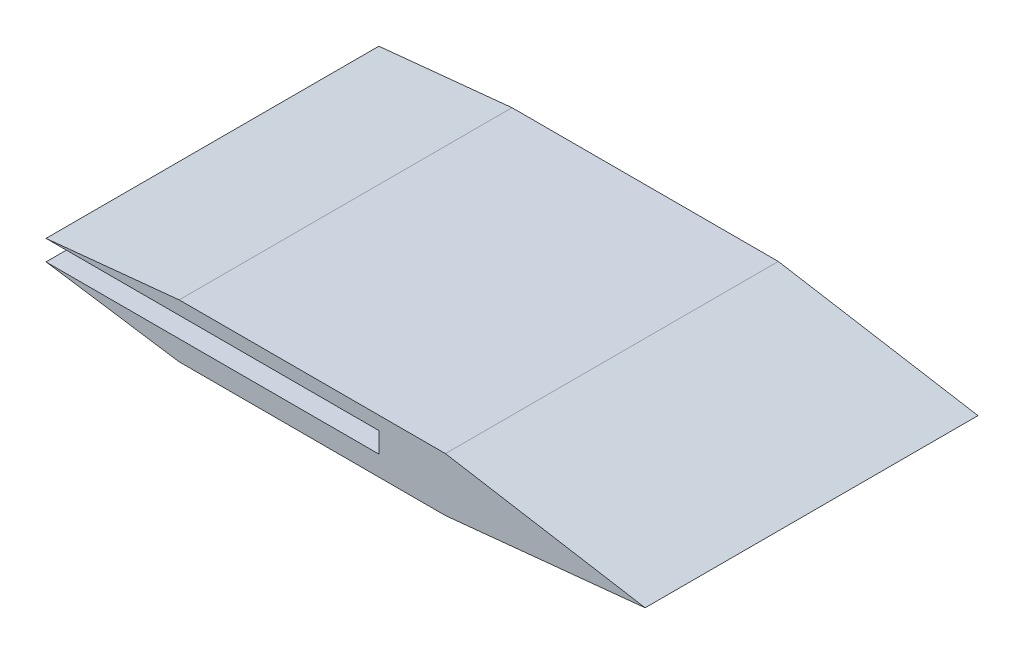
ISO-10303-21;
HEADER;
FILE_DESCRIPTION(('STEP AP214'),'2;1');
FILE_NAME('part.step','',(''),(''),'','','');
FILE_SCHEMA(('AUTOMOTIVE_DESIGN { 1 0 10303 214 1 1 1 1 }'));
ENDSEC;
DATA;
#1=APPLICATION_CONTEXT('core data for automotive mechanical design processes');
#2=APPLICATION_PROTOCOL_DEFINITION('international standard','automotive_design',2000,#1);
#3=PRODUCT_CONTEXT('',#1,'mechanical');
#4=PRODUCT('Part','Part','',(#3));
#5=PRODUCT_RELATED_PRODUCT_CATEGORY('part','',(#4));
#6=PRODUCT_DEFINITION_FORMATION('','',#4);
#7=PRODUCT_DEFINITION_CONTEXT('part definition',#1,'design');
#8=PRODUCT_DEFINITION('design','',#6,#7);
#9=PRODUCT_DEFINITION_SHAPE('','',#8);
#10=(LENGTH_UNIT() NAMED_UNIT(*) SI_UNIT(.MILLI.,.METRE.));
#11=(NAMED_UNIT(*) PLANE_ANGLE_UNIT() SI_UNIT($,.RADIAN.));
#12=(NAMED_UNIT(*) SI_UNIT($,.STERADIAN.) SOLID_ANGLE_UNIT());
#13=UNCERTAINTY_MEASURE_WITH_UNIT(LENGTH_MEASURE(1.E-05),#10,'distance_accuracy_value','');
#14=(GEOMETRIC_REPRESENTATION_CONTEXT(3) GLOBAL_UNCERTAINTY_ASSIGNED_CONTEXT((#13)) GLOBAL_UNIT_ASSIGNED_CONTEXT((#10,
#11,#12)) REPRESENTATION_CONTEXT('',''));
#15=CARTESIAN_POINT('',(0.,0.,0.));
#16=DIRECTION('',(0.,0.,1.));
#17=DIRECTION('',(1.,0.,0.));
#18=AXIS2_PLACEMENT_3D('',#15,#16,#17);
#19=CARTESIAN_POINT('',(50.,0.,50.));
#20=DIRECTION('',(0.,1.,0.));
#21=DIRECTION('',(-1.,0.,0.));
#22=AXIS2_PLACEMENT_3D('',#19,#20,#21);
#23=PLANE('',#22);
#24=DIRECTION('',(1.,0.,0.));
#25=VECTOR('',#24,1.);
#26=CARTESIAN_POINT('',(50.,0.,0.));
#27=LINE('',#26,#25);
#28=CARTESIAN_POINT('',(0.,0.,0.));
#29=VERTEX_POINT('',#28);
#30=CARTESIAN_POINT('',(50.,0.,0.));
#31=VERTEX_POINT('',#30);
#32=EDGE_CURVE('E134',#29,#31,#27,.T.);
#33=ORIENTED_EDGE('',*,*,#32,.T.);
#34=DIRECTION('',(0.,0.,-1.));
#35=VECTOR('',#34,1.);
#36=CARTESIAN_POINT('',(50.,0.,50.));
#37=LINE('',#36,#35);
#38=CARTESIAN_POINT('',(50.,0.,50.));
#39=VERTEX_POINT('',#38);
#40=EDGE_CURVE('E11',#39,#31,#37,.T.);
#41=ORIENTED_EDGE('',*,*,#40,.F.);
#42=DIRECTION('',(1.,0.,0.));
#43=VECTOR('',#42,1.);
#44=CARTESIAN_POINT('',(50.,0.,50.));
#45=LINE('',#44,#43);
#46=CARTESIAN_POINT('',(0.,0.,50.));
#47=VERTEX_POINT('',#46);
#48=EDGE_CURVE('E150',#47,#39,#45,.T.);
#49=ORIENTED_EDGE('',*,*,#48,.F.);
#50=DIRECTION('',(0.,0.,-1.));
#51=VECTOR('',#50,1.);
#52=CARTESIAN_POINT('',(0.,0.,50.));
#53=LINE('',#52,#51);
#54=EDGE_CURVE('E130',#47,#29,#53,.T.);
#55=ORIENTED_EDGE('',*,*,#54,.T.);
#56=EDGE_LOOP('',(#33,#41,#49,#55));
#57=FACE_BOUND('',#56,.T.);
#58=ADVANCED_FACE('F32',(#57),#23,.F.);
#59=CARTESIAN_POINT('',(50.,-3.06,50.));
#60=DIRECTION('',(1.,0.,0.));
#61=DIRECTION('',(0.,0.,-1.));
#62=AXIS2_PLACEMENT_3D('',#59,#60,#61);
#63=PLANE('',#62);
#64=DIRECTION('',(0.,-1.,0.));
#65=VECTOR('',#64,1.);
#66=CARTESIAN_POINT('',(50.,-3.06,0.));
#67=LINE('',#66,#65);
#68=CARTESIAN_POINT('',(50.,-3.06,0.));
#69=VERTEX_POINT('',#68);
#70=EDGE_CURVE('E137',#31,#69,#67,.T.);
#71=ORIENTED_EDGE('',*,*,#70,.T.);
#72=DIRECTION('',(0.,0.,-1.));
#73=VECTOR('',#72,1.);
#74=CARTESIAN_POINT('',(50.,-3.06,50.));
#75=LINE('',#74,#73);
#76=CARTESIAN_POINT('',(50.,-3.06,50.));
#77=VERTEX_POINT('',#76);
#78=EDGE_CURVE('E40',#77,#69,#75,.T.);
#79=ORIENTED_EDGE('',*,*,#78,.F.);
#80=DIRECTION('',(0.,-1.,0.));
#81=VECTOR('',#80,1.);
#82=CARTESIAN_POINT('',(50.,-3.06,50.));
#83=LINE('',#82,#81);
#84=EDGE_CURVE('E94',#39,#77,#83,.T.);
#85=ORIENTED_EDGE('',*,*,#84,.F.);
#86=ORIENTED_EDGE('',*,*,#40,.T.);
#87=EDGE_LOOP('',(#71,#79,#85,#86));
#88=FACE_BOUND('',#87,.T.);
#89=ADVANCED_FACE('F193',(#88),#63,.F.);
#90=CARTESIAN_POINT('',(0.,-3.06,50.));
#91=DIRECTION('',(0.,-1.,0.));
#92=DIRECTION('',(0.,0.,-1.));
#93=AXIS2_PLACEMENT_3D('',#90,#91,#92);
#94=PLANE('',#93);
#95=DIRECTION('',(-1.,0.,0.));
#96=VECTOR('',#95,1.);
#97=CARTESIAN_POINT('',(0.,-3.06,0.));
#98=LINE('',#97,#96);
#99=CARTESIAN_POINT('',(0.,-3.06,0.));
#100=VERTEX_POINT('',#99);
#101=EDGE_CURVE('E139',#69,#100,#98,.T.);
#102=ORIENTED_EDGE('',*,*,#101,.T.);
#103=DIRECTION('',(0.,0.,-1.));
#104=VECTOR('',#103,1.);
#105=CARTESIAN_POINT('',(0.,-3.06,50.));
#106=LINE('',#105,#104);
#107=CARTESIAN_POINT('',(0.,-3.06,50.));
#108=VERTEX_POINT('',#107);
#109=EDGE_CURVE('E160',#108,#100,#106,.T.);
#110=ORIENTED_EDGE('',*,*,#109,.F.);
#111=DIRECTION('',(-1.,0.,0.));
#112=VECTOR('',#111,1.);
#113=CARTESIAN_POINT('',(0.,-3.06,50.));
#114=LINE('',#113,#112);
#115=EDGE_CURVE('E168',#77,#108,#114,.T.);
#116=ORIENTED_EDGE('',*,*,#115,.F.);
#117=ORIENTED_EDGE('',*,*,#78,.T.);
#118=EDGE_LOOP('',(#102,#110,#116,#117));
#119=FACE_BOUND('',#118,.T.);
#120=ADVANCED_FACE('F166',(#119),#94,.F.);
#121=CARTESIAN_POINT('',(20.,-6.06,50.));
#122=DIRECTION('',(0.148340452930245,0.988936352868298,0.));
#123=DIRECTION('',(-0.988936352868298,0.148340452930245,0.));
#124=AXIS2_PLACEMENT_3D('',#121,#122,#123);
#125=PLANE('',#124);
#126=DIRECTION('',(0.988936352868298,-0.148340452930245,0.));
#127=VECTOR('',#126,1.);
#128=CARTESIAN_POINT('',(20.,-6.06,0.));
#129=LINE('',#128,#127);
#130=CARTESIAN_POINT('',(20.,-6.06,0.));
#131=VERTEX_POINT('',#130);
#132=EDGE_CURVE('E141',#100,#131,#129,.T.);
#133=ORIENTED_EDGE('',*,*,#132,.T.);
#134=DIRECTION('',(0.,0.,-1.));
#135=VECTOR('',#134,1.);
#136=CARTESIAN_POINT('',(20.,-6.06,50.));
#137=LINE('',#136,#135);
#138=CARTESIAN_POINT('',(20.,-6.06,50.));
#139=VERTEX_POINT('',#138);
#140=EDGE_CURVE('E157',#139,#131,#137,.T.);
#141=ORIENTED_EDGE('',*,*,#140,.F.);
#142=DIRECTION('',(0.988936352868298,-0.148340452930245,0.));
#143=VECTOR('',#142,1.);
#144=CARTESIAN_POINT('',(20.,-6.06,50.));
#145=LINE('',#144,#143);
#146=EDGE_CURVE('E184',#108,#139,#145,.T.);
#147=ORIENTED_EDGE('',*,*,#146,.F.);
#148=ORIENTED_EDGE('',*,*,#109,.T.);
#149=EDGE_LOOP('',(#133,#141,#147,#148));
#150=FACE_BOUND('',#149,.T.);
#151=ADVANCED_FACE('F177',(#150),#125,.F.);
#152=CARTESIAN_POINT('',(60.,-6.06,50.));
#153=DIRECTION('',(0.,1.,0.));
#154=DIRECTION('',(-1.,0.,0.));
#155=AXIS2_PLACEMENT_3D('',#152,#153,#154);
#156=PLANE('',#155);
#157=DIRECTION('',(1.,0.,0.));
#158=VECTOR('',#157,1.);
#159=CARTESIAN_POINT('',(60.,-6.06,0.));
#160=LINE('',#159,#158);
#161=CARTESIAN_POINT('',(60.,-6.06,0.));
#162=VERTEX_POINT('',#161);
#163=EDGE_CURVE('E143',#131,#162,#160,.T.);
#164=ORIENTED_EDGE('',*,*,#163,.T.);
#165=DIRECTION('',(0.,0.,-1.));
#166=VECTOR('',#165,1.);
#167=CARTESIAN_POINT('',(60.,-6.06,50.));
#168=LINE('',#167,#166);
#169=CARTESIAN_POINT('',(60.,-6.06,50.));
#170=VERTEX_POINT('',#169);
#171=EDGE_CURVE('E154',#170,#162,#168,.T.);
#172=ORIENTED_EDGE('',*,*,#171,.F.);
#173=DIRECTION('',(1.,0.,0.));
#174=VECTOR('',#173,1.);
#175=CARTESIAN_POINT('',(60.,-6.06,50.));
#176=LINE('',#175,#174);
#177=EDGE_CURVE('E183',#139,#170,#176,.T.);
#178=ORIENTED_EDGE('',*,*,#177,.F.);
#179=ORIENTED_EDGE('',*,*,#140,.T.);
#180=EDGE_LOOP('',(#164,#172,#178,#179));
#181=FACE_BOUND('',#180,.T.);
#182=ADVANCED_FACE('F181',(#181),#156,.F.);
#183=CARTESIAN_POINT('',(90.,-3.06,50.));
#184=DIRECTION('',(-0.0995037190209989,0.995037190209989,0.));
#185=DIRECTION('',(-0.995037190209989,-0.0995037190209989,0.));
#186=AXIS2_PLACEMENT_3D('',#183,#184,#185);
#187=PLANE('',#186);
#188=DIRECTION('',(0.995037190209989,0.0995037190209989,0.));
#189=VECTOR('',#188,1.);
#190=CARTESIAN_POINT('',(90.,-3.06,0.));
#191=LINE('',#190,#189);
#192=CARTESIAN_POINT('',(90.,-3.06,0.));
#193=VERTEX_POINT('',#192);
#194=EDGE_CURVE('E145',#162,#193,#191,.T.);
#195=ORIENTED_EDGE('',*,*,#194,.T.);
#196=DIRECTION('',(0.,0.,-1.));
#197=VECTOR('',#196,1.);
#198=CARTESIAN_POINT('',(90.,-3.06,50.));
#199=LINE('',#198,#197);
#200=CARTESIAN_POINT('',(90.,-3.06,50.));
#201=VERTEX_POINT('',#200);
#202=EDGE_CURVE('E125',#201,#193,#199,.T.);
#203=ORIENTED_EDGE('',*,*,#202,.F.);
#204=DIRECTION('',(0.995037190209989,0.0995037190209989,0.));
#205=VECTOR('',#204,1.);
#206=CARTESIAN_POINT('',(90.,-3.06,50.));
#207=LINE('',#206,#205);
#208=EDGE_CURVE('E116',#170,#201,#207,.T.);
#209=ORIENTED_EDGE('',*,*,#208,.F.);
#210=ORIENTED_EDGE('',*,*,#171,.T.);
#211=EDGE_LOOP('',(#195,#203,#209,#210));
#212=FACE_BOUND('',#211,.T.);
#213=ADVANCED_FACE('F205',(#212),#187,.F.);
#214=CARTESIAN_POINT('',(60.,2.,50.));
#215=DIRECTION('',(-0.166317519540524,-0.986072250240259,0.));
#216=DIRECTION('',(0.986072250240259,-0.166317519540524,0.));
#217=AXIS2_PLACEMENT_3D('',#214,#215,#216);
#218=PLANE('',#217);
#219=DIRECTION('',(-0.986072250240259,0.166317519540524,0.));
#220=VECTOR('',#219,1.);
#221=CARTESIAN_POINT('',(60.,2.,0.));
#222=LINE('',#221,#220);
#223=CARTESIAN_POINT('',(60.,2.,0.));
#224=VERTEX_POINT('',#223);
#225=EDGE_CURVE('E124',#193,#224,#222,.T.);
#226=ORIENTED_EDGE('',*,*,#225,.T.);
#227=DIRECTION('',(0.,0.,-1.));
#228=VECTOR('',#227,1.);
#229=CARTESIAN_POINT('',(60.,2.,50.));
#230=LINE('',#229,#228);
#231=CARTESIAN_POINT('',(60.,2.,50.));
#232=VERTEX_POINT('',#231);
#233=EDGE_CURVE('E121',#232,#224,#230,.T.);
#234=ORIENTED_EDGE('',*,*,#233,.F.);
#235=DIRECTION('',(-0.986072250240259,0.166317519540524,0.));
#236=VECTOR('',#235,1.);
#237=CARTESIAN_POINT('',(60.,2.,50.));
#238=LINE('',#237,#236);
#239=EDGE_CURVE('E110',#201,#232,#238,.T.);
#240=ORIENTED_EDGE('',*,*,#239,.F.);
#241=ORIENTED_EDGE('',*,*,#202,.T.);
#242=EDGE_LOOP('',(#226,#234,#240,#241));
#243=FACE_BOUND('',#242,.T.);
#244=ADVANCED_FACE('F122',(#243),#218,.F.);
#245=CARTESIAN_POINT('',(20.,2.,50.));
#246=DIRECTION('',(0.,-1.,0.));
#247=DIRECTION('',(0.,0.,-1.));
#248=AXIS2_PLACEMENT_3D('',#245,#246,#247);
#249=PLANE('',#248);
#250=DIRECTION('',(-1.,0.,0.));
#251=VECTOR('',#250,1.);
#252=CARTESIAN_POINT('',(20.,2.,0.));
#253=LINE('',#252,#251);
#254=CARTESIAN_POINT('',(20.,2.,0.));
#255=VERTEX_POINT('',#254);
#256=EDGE_CURVE('E80',#224,#255,#253,.T.);
#257=ORIENTED_EDGE('',*,*,#256,.T.);
#258=DIRECTION('',(0.,0.,-1.));
#259=VECTOR('',#258,1.);
#260=CARTESIAN_POINT('',(20.,2.,50.));
#261=LINE('',#260,#259);
#262=CARTESIAN_POINT('',(20.,2.,50.));
#263=VERTEX_POINT('',#262);
#264=EDGE_CURVE('E126',#263,#255,#261,.T.);
#265=ORIENTED_EDGE('',*,*,#264,.F.);
#266=DIRECTION('',(-1.,0.,0.));
#267=VECTOR('',#266,1.);
#268=CARTESIAN_POINT('',(20.,2.,50.));
#269=LINE('',#268,#267);
#270=EDGE_CURVE('E114',#232,#263,#269,.T.);
#271=ORIENTED_EDGE('',*,*,#270,.F.);
#272=ORIENTED_EDGE('',*,*,#233,.T.);
#273=EDGE_LOOP('',(#257,#265,#271,#272));
#274=FACE_BOUND('',#273,.T.);
#275=ADVANCED_FACE('F128',(#274),#249,.F.);
#276=CARTESIAN_POINT('',(0.,0.,50.));
#277=DIRECTION('',(0.0995037190209987,-0.995037190209989,0.));
#278=DIRECTION('',(0.995037190209989,0.0995037190209987,0.));
#279=AXIS2_PLACEMENT_3D('',#276,#277,#278);
#280=PLANE('',#279);
#281=DIRECTION('',(-0.995037190209989,-0.0995037190209987,0.));
#282=VECTOR('',#281,1.);
#283=CARTESIAN_POINT('',(0.,0.,0.));
#284=LINE('',#283,#282);
#285=EDGE_CURVE('E86',#255,#29,#284,.T.);
#286=ORIENTED_EDGE('',*,*,#285,.T.);
#287=ORIENTED_EDGE('',*,*,#54,.F.);
#288=DIRECTION('',(-0.995037190209989,-0.0995037190209987,0.));
#289=VECTOR('',#288,1.);
#290=CARTESIAN_POINT('',(0.,0.,50.));
#291=LINE('',#290,#289);
#292=EDGE_CURVE('E48',#263,#47,#291,.T.);
#293=ORIENTED_EDGE('',*,*,#292,.F.);
#294=ORIENTED_EDGE('',*,*,#264,.T.);
#295=EDGE_LOOP('',(#286,#287,#293,#294));
#296=FACE_BOUND('',#295,.T.);
#297=ADVANCED_FACE('F213',(#296),#280,.F.);
#298=CARTESIAN_POINT('',(0.,0.,50.));
#299=DIRECTION('',(0.,0.,-1.));
#300=DIRECTION('',(-1.,0.,0.));
#301=AXIS2_PLACEMENT_3D('',#298,#299,#300);
#302=PLANE('',#301);
#303=ORIENTED_EDGE('',*,*,#48,.T.);
#304=ORIENTED_EDGE('',*,*,#84,.T.);
#305=ORIENTED_EDGE('',*,*,#115,.T.);
#306=ORIENTED_EDGE('',*,*,#146,.T.);
#307=ORIENTED_EDGE('',*,*,#177,.T.);
#308=ORIENTED_EDGE('',*,*,#208,.T.);
#309=ORIENTED_EDGE('',*,*,#239,.T.);
#310=ORIENTED_EDGE('',*,*,#270,.T.);
#311=ORIENTED_EDGE('',*,*,#292,.T.);
#312=EDGE_LOOP('',(#303,#304,#305,#306,#307,#308,#309,#310,#311));
#313=FACE_BOUND('',#312,.T.);
#314=ADVANCED_FACE('F112',(#313),#302,.F.);
#315=CARTESIAN_POINT('',(0.,0.,0.));
#316=DIRECTION('',(0.,0.,-1.));
#317=DIRECTION('',(-1.,0.,0.));
#318=AXIS2_PLACEMENT_3D('',#315,#316,#317);
#319=PLANE('',#318);
#320=ORIENTED_EDGE('',*,*,#32,.F.);
#321=ORIENTED_EDGE('',*,*,#285,.F.);
#322=ORIENTED_EDGE('',*,*,#256,.F.);
#323=ORIENTED_EDGE('',*,*,#225,.F.);
#324=ORIENTED_EDGE('',*,*,#194,.F.);
#325=ORIENTED_EDGE('',*,*,#163,.F.);
#326=ORIENTED_EDGE('',*,*,#132,.F.);
#327=ORIENTED_EDGE('',*,*,#101,.F.);
#328=ORIENTED_EDGE('',*,*,#70,.F.);
#329=EDGE_LOOP('',(#320,#321,#322,#323,#324,#325,#326,#327,#328));
#330=FACE_BOUND('',#329,.T.);
#331=ADVANCED_FACE('F172',(#330),#319,.T.);
#332=CLOSED_SHELL('',(#58,#89,#120,#151,#182,#213,#244,#275,#297,#314,#331));
#333=MANIFOLD_SOLID_BREP('B2',#332);
#334=ADVANCED_BREP_SHAPE_REPRESENTATION('',(#18,#333),#14);
#335=SHAPE_DEFINITION_REPRESENTATION(#9,#334);
ENDSEC;
END-ISO-10303-21;
